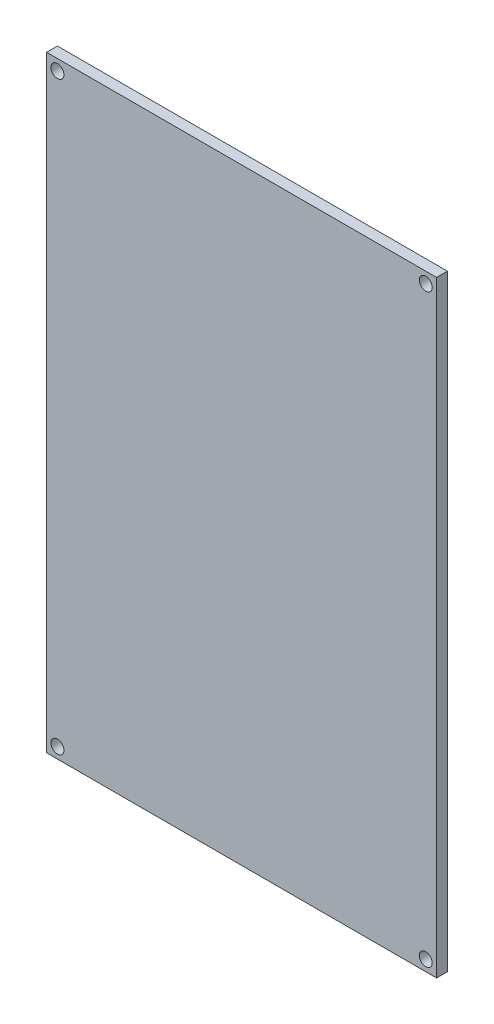
ISO-10303-21;
HEADER;
FILE_DESCRIPTION(('STEP AP214'),'2;1');
FILE_NAME('part.step','',(''),(''),'','','');
FILE_SCHEMA(('AUTOMOTIVE_DESIGN { 1 0 10303 214 1 1 1 1 }'));
ENDSEC;
DATA;
#1=APPLICATION_CONTEXT('core data for automotive mechanical design processes');
#2=APPLICATION_PROTOCOL_DEFINITION('international standard','automotive_design',2000,#1);
#3=PRODUCT_CONTEXT('',#1,'mechanical');
#4=PRODUCT('Part','Part','',(#3));
#5=PRODUCT_RELATED_PRODUCT_CATEGORY('part','',(#4));
#6=PRODUCT_DEFINITION_FORMATION('','',#4);
#7=PRODUCT_DEFINITION_CONTEXT('part definition',#1,'design');
#8=PRODUCT_DEFINITION('design','',#6,#7);
#9=PRODUCT_DEFINITION_SHAPE('','',#8);
#10=(LENGTH_UNIT() NAMED_UNIT(*) SI_UNIT(.MILLI.,.METRE.));
#11=(NAMED_UNIT(*) PLANE_ANGLE_UNIT() SI_UNIT($,.RADIAN.));
#12=(NAMED_UNIT(*) SI_UNIT($,.STERADIAN.) SOLID_ANGLE_UNIT());
#13=UNCERTAINTY_MEASURE_WITH_UNIT(LENGTH_MEASURE(1.E-05),#10,'distance_accuracy_value','');
#14=(GEOMETRIC_REPRESENTATION_CONTEXT(3) GLOBAL_UNCERTAINTY_ASSIGNED_CONTEXT((#13)) GLOBAL_UNIT_ASSIGNED_CONTEXT((#10,
#11,#12)) REPRESENTATION_CONTEXT('',''));
#15=CARTESIAN_POINT('',(0.,0.,0.));
#16=DIRECTION('',(0.,0.,1.));
#17=DIRECTION('',(1.,0.,0.));
#18=AXIS2_PLACEMENT_3D('',#15,#16,#17);
#19=CARTESIAN_POINT('',(0.,0.,3.175));
#20=DIRECTION('',(1.,0.,0.));
#21=DIRECTION('',(0.,0.,-1.));
#22=AXIS2_PLACEMENT_3D('',#19,#20,#21);
#23=PLANE('',#22);
#24=DIRECTION('',(0.,-1.,0.));
#25=VECTOR('',#24,1.);
#26=CARTESIAN_POINT('',(0.,0.,0.));
#27=LINE('',#26,#25);
#28=CARTESIAN_POINT('',(0.,177.8,0.));
#29=VERTEX_POINT('',#28);
#30=CARTESIAN_POINT('',(0.,0.,0.));
#31=VERTEX_POINT('',#30);
#32=EDGE_CURVE('E96',#29,#31,#27,.T.);
#33=ORIENTED_EDGE('',*,*,#32,.T.);
#34=DIRECTION('',(0.,0.,-1.));
#35=VECTOR('',#34,1.);
#36=CARTESIAN_POINT('',(0.,0.,3.175));
#37=LINE('',#36,#35);
#38=CARTESIAN_POINT('',(0.,0.,3.175));
#39=VERTEX_POINT('',#38);
#40=EDGE_CURVE('E11',#39,#31,#37,.T.);
#41=ORIENTED_EDGE('',*,*,#40,.F.);
#42=DIRECTION('',(0.,-1.,0.));
#43=VECTOR('',#42,1.);
#44=CARTESIAN_POINT('',(0.,0.,3.175));
#45=LINE('',#44,#43);
#46=CARTESIAN_POINT('',(0.,177.8,3.175));
#47=VERTEX_POINT('',#46);
#48=EDGE_CURVE('E84',#47,#39,#45,.T.);
#49=ORIENTED_EDGE('',*,*,#48,.F.);
#50=DIRECTION('',(0.,0.,-1.));
#51=VECTOR('',#50,1.);
#52=CARTESIAN_POINT('',(0.,177.8,3.175));
#53=LINE('',#52,#51);
#54=EDGE_CURVE('E92',#47,#29,#53,.T.);
#55=ORIENTED_EDGE('',*,*,#54,.T.);
#56=EDGE_LOOP('',(#33,#41,#49,#55));
#57=FACE_BOUND('',#56,.T.);
#58=ADVANCED_FACE('F33',(#57),#23,.F.);
#59=CARTESIAN_POINT('',(0.,0.,3.175));
#60=DIRECTION('',(0.,1.,0.));
#61=DIRECTION('',(0.,0.,1.));
#62=AXIS2_PLACEMENT_3D('',#59,#60,#61);
#63=PLANE('',#62);
#64=DIRECTION('',(1.,0.,0.));
#65=VECTOR('',#64,1.);
#66=CARTESIAN_POINT('',(0.,0.,0.));
#67=LINE('',#66,#65);
#68=CARTESIAN_POINT('',(114.3,0.,0.));
#69=VERTEX_POINT('',#68);
#70=EDGE_CURVE('E88',#31,#69,#67,.T.);
#71=ORIENTED_EDGE('',*,*,#70,.T.);
#72=DIRECTION('',(0.,0.,-1.));
#73=VECTOR('',#72,1.);
#74=CARTESIAN_POINT('',(114.3,0.,3.175));
#75=LINE('',#74,#73);
#76=CARTESIAN_POINT('',(114.3,0.,3.175));
#77=VERTEX_POINT('',#76);
#78=EDGE_CURVE('E41',#77,#69,#75,.T.);
#79=ORIENTED_EDGE('',*,*,#78,.F.);
#80=DIRECTION('',(1.,0.,0.));
#81=VECTOR('',#80,1.);
#82=CARTESIAN_POINT('',(0.,0.,3.175));
#83=LINE('',#82,#81);
#84=EDGE_CURVE('E79',#39,#77,#83,.T.);
#85=ORIENTED_EDGE('',*,*,#84,.F.);
#86=ORIENTED_EDGE('',*,*,#40,.T.);
#87=EDGE_LOOP('',(#71,#79,#85,#86));
#88=FACE_BOUND('',#87,.T.);
#89=ADVANCED_FACE('F87',(#88),#63,.F.);
#90=CARTESIAN_POINT('',(114.3,0.,3.175));
#91=DIRECTION('',(-1.,0.,0.));
#92=DIRECTION('',(0.,0.,1.));
#93=AXIS2_PLACEMENT_3D('',#90,#91,#92);
#94=PLANE('',#93);
#95=DIRECTION('',(0.,1.,0.));
#96=VECTOR('',#95,1.);
#97=CARTESIAN_POINT('',(114.3,0.,0.));
#98=LINE('',#97,#96);
#99=CARTESIAN_POINT('',(114.3,177.8,0.));
#100=VERTEX_POINT('',#99);
#101=EDGE_CURVE('E66',#69,#100,#98,.T.);
#102=ORIENTED_EDGE('',*,*,#101,.T.);
#103=DIRECTION('',(0.,0.,-1.));
#104=VECTOR('',#103,1.);
#105=CARTESIAN_POINT('',(114.3,177.8,3.175));
#106=LINE('',#105,#104);
#107=CARTESIAN_POINT('',(114.3,177.8,3.175));
#108=VERTEX_POINT('',#107);
#109=EDGE_CURVE('E89',#108,#100,#106,.T.);
#110=ORIENTED_EDGE('',*,*,#109,.F.);
#111=DIRECTION('',(0.,1.,0.));
#112=VECTOR('',#111,1.);
#113=CARTESIAN_POINT('',(114.3,0.,3.175));
#114=LINE('',#113,#112);
#115=EDGE_CURVE('E82',#77,#108,#114,.T.);
#116=ORIENTED_EDGE('',*,*,#115,.F.);
#117=ORIENTED_EDGE('',*,*,#78,.T.);
#118=EDGE_LOOP('',(#102,#110,#116,#117));
#119=FACE_BOUND('',#118,.T.);
#120=ADVANCED_FACE('F90',(#119),#94,.F.);
#121=CARTESIAN_POINT('',(0.,177.8,3.175));
#122=DIRECTION('',(0.,-1.,0.));
#123=DIRECTION('',(0.,0.,-1.));
#124=AXIS2_PLACEMENT_3D('',#121,#122,#123);
#125=PLANE('',#124);
#126=DIRECTION('',(-1.,0.,0.));
#127=VECTOR('',#126,1.);
#128=CARTESIAN_POINT('',(0.,177.8,0.));
#129=LINE('',#128,#127);
#130=EDGE_CURVE('E72',#100,#29,#129,.T.);
#131=ORIENTED_EDGE('',*,*,#130,.T.);
#132=ORIENTED_EDGE('',*,*,#54,.F.);
#133=DIRECTION('',(-1.,0.,0.));
#134=VECTOR('',#133,1.);
#135=CARTESIAN_POINT('',(0.,177.8,3.175));
#136=LINE('',#135,#134);
#137=EDGE_CURVE('E49',#108,#47,#136,.T.);
#138=ORIENTED_EDGE('',*,*,#137,.F.);
#139=ORIENTED_EDGE('',*,*,#109,.T.);
#140=EDGE_LOOP('',(#131,#132,#138,#139));
#141=FACE_BOUND('',#140,.T.);
#142=ADVANCED_FACE('F104',(#141),#125,.F.);
#143=CARTESIAN_POINT('',(0.,0.,3.175));
#144=DIRECTION('',(0.,0.,-1.));
#145=DIRECTION('',(-1.,0.,0.));
#146=AXIS2_PLACEMENT_3D('',#143,#144,#145);
#147=PLANE('',#146);
#148=CARTESIAN_POINT('',(3.175,3.17500000000001,3.175));
#149=DIRECTION('',(0.,0.,1.));
#150=DIRECTION('',(1.,0.,0.));
#151=AXIS2_PLACEMENT_3D('',#148,#149,#150);
#152=CIRCLE('',#151,1.905);
#153=CARTESIAN_POINT('',(5.08,3.17500000000001,3.175));
#154=VERTEX_POINT('',#153);
#155=EDGE_CURVE('E128',#154,#154,#152,.T.);
#156=ORIENTED_EDGE('',*,*,#155,.F.);
#157=EDGE_LOOP('',(#156));
#158=FACE_BOUND('',#157,.T.);
#159=CARTESIAN_POINT('',(111.125,3.175,3.175));
#160=DIRECTION('',(0.,0.,1.));
#161=DIRECTION('',(1.,0.,0.));
#162=AXIS2_PLACEMENT_3D('',#159,#160,#161);
#163=CIRCLE('',#162,1.90500000000001);
#164=CARTESIAN_POINT('',(113.03,3.175,3.175));
#165=VERTEX_POINT('',#164);
#166=EDGE_CURVE('E122',#165,#165,#163,.T.);
#167=ORIENTED_EDGE('',*,*,#166,.F.);
#168=EDGE_LOOP('',(#167));
#169=FACE_BOUND('',#168,.T.);
#170=CARTESIAN_POINT('',(111.125,174.625,3.175));
#171=DIRECTION('',(0.,0.,1.));
#172=DIRECTION('',(1.,0.,0.));
#173=AXIS2_PLACEMENT_3D('',#170,#171,#172);
#174=CIRCLE('',#173,1.905);
#175=CARTESIAN_POINT('',(113.03,174.625,3.175));
#176=VERTEX_POINT('',#175);
#177=EDGE_CURVE('E116',#176,#176,#174,.T.);
#178=ORIENTED_EDGE('',*,*,#177,.F.);
#179=EDGE_LOOP('',(#178));
#180=FACE_BOUND('',#179,.T.);
#181=CARTESIAN_POINT('',(3.175,174.625,3.175));
#182=DIRECTION('',(0.,0.,1.));
#183=DIRECTION('',(1.,0.,0.));
#184=AXIS2_PLACEMENT_3D('',#181,#182,#183);
#185=CIRCLE('',#184,1.905);
#186=CARTESIAN_POINT('',(5.08,174.625,3.175));
#187=VERTEX_POINT('',#186);
#188=EDGE_CURVE('E110',#187,#187,#185,.T.);
#189=ORIENTED_EDGE('',*,*,#188,.F.);
#190=EDGE_LOOP('',(#189));
#191=FACE_BOUND('',#190,.T.);
#192=ORIENTED_EDGE('',*,*,#48,.T.);
#193=ORIENTED_EDGE('',*,*,#84,.T.);
#194=ORIENTED_EDGE('',*,*,#115,.T.);
#195=ORIENTED_EDGE('',*,*,#137,.T.);
#196=EDGE_LOOP('',(#192,#193,#194,#195));
#197=FACE_BOUND('',#196,.T.);
#198=ADVANCED_FACE('F80',(#158,#169,#180,#191,#197),#147,.F.);
#199=CARTESIAN_POINT('',(0.,0.,0.));
#200=DIRECTION('',(0.,0.,-1.));
#201=DIRECTION('',(-1.,0.,0.));
#202=AXIS2_PLACEMENT_3D('',#199,#200,#201);
#203=PLANE('',#202);
#204=CARTESIAN_POINT('',(3.175,3.17500000000001,0.));
#205=DIRECTION('',(0.,0.,1.));
#206=DIRECTION('',(1.,0.,0.));
#207=AXIS2_PLACEMENT_3D('',#204,#205,#206);
#208=CIRCLE('',#207,1.905);
#209=CARTESIAN_POINT('',(5.08,3.17500000000001,0.));
#210=VERTEX_POINT('',#209);
#211=EDGE_CURVE('E125',#210,#210,#208,.T.);
#212=ORIENTED_EDGE('',*,*,#211,.T.);
#213=EDGE_LOOP('',(#212));
#214=FACE_BOUND('',#213,.T.);
#215=CARTESIAN_POINT('',(111.125,3.175,0.));
#216=DIRECTION('',(0.,0.,1.));
#217=DIRECTION('',(1.,0.,0.));
#218=AXIS2_PLACEMENT_3D('',#215,#216,#217);
#219=CIRCLE('',#218,1.90500000000001);
#220=CARTESIAN_POINT('',(113.03,3.175,0.));
#221=VERTEX_POINT('',#220);
#222=EDGE_CURVE('E119',#221,#221,#219,.T.);
#223=ORIENTED_EDGE('',*,*,#222,.T.);
#224=EDGE_LOOP('',(#223));
#225=FACE_BOUND('',#224,.T.);
#226=CARTESIAN_POINT('',(111.125,174.625,0.));
#227=DIRECTION('',(0.,0.,1.));
#228=DIRECTION('',(1.,0.,0.));
#229=AXIS2_PLACEMENT_3D('',#226,#227,#228);
#230=CIRCLE('',#229,1.905);
#231=CARTESIAN_POINT('',(113.03,174.625,0.));
#232=VERTEX_POINT('',#231);
#233=EDGE_CURVE('E113',#232,#232,#230,.T.);
#234=ORIENTED_EDGE('',*,*,#233,.T.);
#235=EDGE_LOOP('',(#234));
#236=FACE_BOUND('',#235,.T.);
#237=CARTESIAN_POINT('',(3.175,174.625,0.));
#238=DIRECTION('',(0.,0.,1.));
#239=DIRECTION('',(1.,0.,0.));
#240=AXIS2_PLACEMENT_3D('',#237,#238,#239);
#241=CIRCLE('',#240,1.905);
#242=CARTESIAN_POINT('',(5.08,174.625,0.));
#243=VERTEX_POINT('',#242);
#244=EDGE_CURVE('E99',#243,#243,#241,.T.);
#245=ORIENTED_EDGE('',*,*,#244,.T.);
#246=EDGE_LOOP('',(#245));
#247=FACE_BOUND('',#246,.T.);
#248=ORIENTED_EDGE('',*,*,#32,.F.);
#249=ORIENTED_EDGE('',*,*,#130,.F.);
#250=ORIENTED_EDGE('',*,*,#101,.F.);
#251=ORIENTED_EDGE('',*,*,#70,.F.);
#252=EDGE_LOOP('',(#248,#249,#250,#251));
#253=FACE_BOUND('',#252,.T.);
#254=ADVANCED_FACE('F107',(#214,#225,#236,#247,#253),#203,.T.);
#255=CARTESIAN_POINT('',(3.175,174.625,0.));
#256=DIRECTION('',(0.,0.,1.));
#257=DIRECTION('',(1.,0.,0.));
#258=AXIS2_PLACEMENT_3D('',#255,#256,#257);
#259=CYLINDRICAL_SURFACE('',#258,1.905);
#260=ORIENTED_EDGE('',*,*,#244,.F.);
#261=EDGE_LOOP('',(#260));
#262=FACE_BOUND('',#261,.T.);
#263=ORIENTED_EDGE('',*,*,#188,.T.);
#264=EDGE_LOOP('',(#263));
#265=FACE_BOUND('',#264,.T.);
#266=ADVANCED_FACE('F152',(#262,#265),#259,.F.);
#267=CARTESIAN_POINT('',(111.125,174.625,0.));
#268=DIRECTION('',(0.,0.,1.));
#269=DIRECTION('',(1.,0.,0.));
#270=AXIS2_PLACEMENT_3D('',#267,#268,#269);
#271=CYLINDRICAL_SURFACE('',#270,1.905);
#272=ORIENTED_EDGE('',*,*,#233,.F.);
#273=EDGE_LOOP('',(#272));
#274=FACE_BOUND('',#273,.T.);
#275=ORIENTED_EDGE('',*,*,#177,.T.);
#276=EDGE_LOOP('',(#275));
#277=FACE_BOUND('',#276,.T.);
#278=ADVANCED_FACE('F154',(#274,#277),#271,.F.);
#279=CARTESIAN_POINT('',(111.125,3.175,0.));
#280=DIRECTION('',(0.,0.,1.));
#281=DIRECTION('',(1.,0.,0.));
#282=AXIS2_PLACEMENT_3D('',#279,#280,#281);
#283=CYLINDRICAL_SURFACE('',#282,1.90500000000001);
#284=ORIENTED_EDGE('',*,*,#222,.F.);
#285=EDGE_LOOP('',(#284));
#286=FACE_BOUND('',#285,.T.);
#287=ORIENTED_EDGE('',*,*,#166,.T.);
#288=EDGE_LOOP('',(#287));
#289=FACE_BOUND('',#288,.T.);
#290=ADVANCED_FACE('F139',(#286,#289),#283,.F.);
#291=CARTESIAN_POINT('',(3.175,3.17500000000001,0.));
#292=DIRECTION('',(0.,0.,1.));
#293=DIRECTION('',(1.,0.,0.));
#294=AXIS2_PLACEMENT_3D('',#291,#292,#293);
#295=CYLINDRICAL_SURFACE('',#294,1.905);
#296=ORIENTED_EDGE('',*,*,#211,.F.);
#297=EDGE_LOOP('',(#296));
#298=FACE_BOUND('',#297,.T.);
#299=ORIENTED_EDGE('',*,*,#155,.T.);
#300=EDGE_LOOP('',(#299));
#301=FACE_BOUND('',#300,.T.);
#302=ADVANCED_FACE('F136',(#298,#301),#295,.F.);
#303=CLOSED_SHELL('',(#58,#89,#120,#142,#198,#254,#266,#278,#290,#302));
#304=MANIFOLD_SOLID_BREP('B2',#303);
#305=ADVANCED_BREP_SHAPE_REPRESENTATION('',(#18,#304),#14);
#306=SHAPE_DEFINITION_REPRESENTATION(#9,#305);
ENDSEC;
END-ISO-10303-21;
